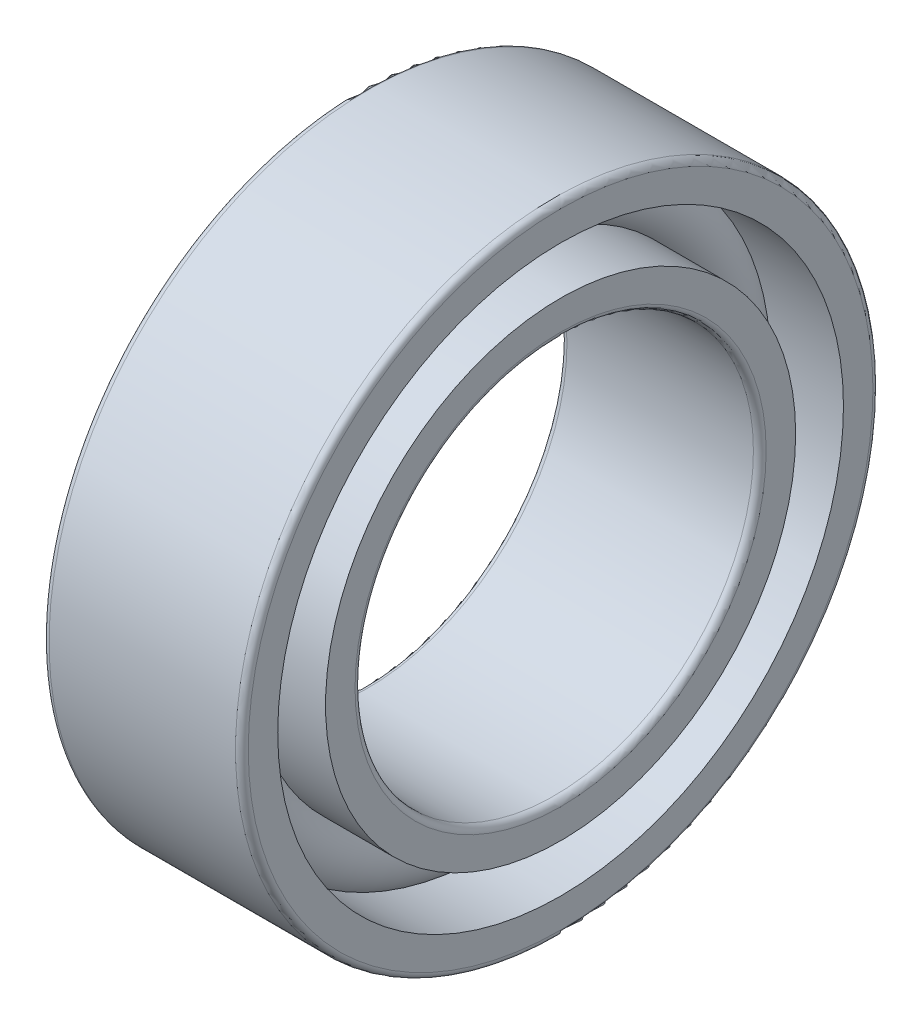
ISO-10303-21;
HEADER;
FILE_DESCRIPTION(('STEP AP214'),'2;1');
FILE_NAME('part.step','',(''),(''),'','','');
FILE_SCHEMA(('AUTOMOTIVE_DESIGN { 1 0 10303 214 1 1 1 1 }'));
ENDSEC;
DATA;
#1=APPLICATION_CONTEXT('core data for automotive mechanical design processes');
#2=APPLICATION_PROTOCOL_DEFINITION('international standard','automotive_design',2000,#1);
#3=PRODUCT_CONTEXT('',#1,'mechanical');
#4=PRODUCT('Part','Part','',(#3));
#5=PRODUCT_RELATED_PRODUCT_CATEGORY('part','',(#4));
#6=PRODUCT_DEFINITION_FORMATION('','',#4);
#7=PRODUCT_DEFINITION_CONTEXT('part definition',#1,'design');
#8=PRODUCT_DEFINITION('design','',#6,#7);
#9=PRODUCT_DEFINITION_SHAPE('','',#8);
#10=(LENGTH_UNIT() NAMED_UNIT(*) SI_UNIT(.MILLI.,.METRE.));
#11=(NAMED_UNIT(*) PLANE_ANGLE_UNIT() SI_UNIT($,.RADIAN.));
#12=(NAMED_UNIT(*) SI_UNIT($,.STERADIAN.) SOLID_ANGLE_UNIT());
#13=UNCERTAINTY_MEASURE_WITH_UNIT(LENGTH_MEASURE(1.E-05),#10,'distance_accuracy_value','');
#14=(GEOMETRIC_REPRESENTATION_CONTEXT(3) GLOBAL_UNCERTAINTY_ASSIGNED_CONTEXT((#13)) GLOBAL_UNIT_ASSIGNED_CONTEXT((#10,
#11,#12)) REPRESENTATION_CONTEXT('',''));
#15=CARTESIAN_POINT('',(0.,0.,0.));
#16=DIRECTION('',(0.,0.,1.));
#17=DIRECTION('',(1.,0.,0.));
#18=AXIS2_PLACEMENT_3D('',#15,#16,#17);
#19=CARTESIAN_POINT('',(0.,0.,0.));
#20=DIRECTION('',(-1.,0.,0.));
#21=DIRECTION('',(0.,0.,1.));
#22=AXIS2_PLACEMENT_3D('',#19,#20,#21);
#23=TOROIDAL_SURFACE('',#22,3.25,0.45);
#24=CARTESIAN_POINT('',(0.335410196624964,0.,0.));
#25=DIRECTION('',(-1.,0.,0.));
#26=DIRECTION('',(0.,0.,1.));
#27=AXIS2_PLACEMENT_3D('',#24,#25,#26);
#28=CIRCLE('',#27,3.55);
#29=CARTESIAN_POINT('',(0.335410196624964,0.,3.55));
#30=VERTEX_POINT('',#29);
#31=EDGE_CURVE('E35',#30,#30,#28,.F.);
#32=ORIENTED_EDGE('',*,*,#31,.T.);
#33=EDGE_LOOP('',(#32));
#34=FACE_BOUND('',#33,.T.);
#35=CARTESIAN_POINT('',(0.335410196624969,0.,0.));
#36=DIRECTION('',(-1.,0.,0.));
#37=DIRECTION('',(0.,0.,1.));
#38=AXIS2_PLACEMENT_3D('',#35,#36,#37);
#39=CIRCLE('',#38,2.95);
#40=CARTESIAN_POINT('',(0.335410196624969,0.,2.95));
#41=VERTEX_POINT('',#40);
#42=EDGE_CURVE('E10',#41,#41,#39,.T.);
#43=ORIENTED_EDGE('',*,*,#42,.T.);
#44=EDGE_LOOP('',(#43));
#45=FACE_BOUND('',#44,.T.);
#46=ADVANCED_FACE('F31',(#34,#45),#23,.T.);
#47=CARTESIAN_POINT('',(-20.6375,0.,0.));
#48=DIRECTION('',(1.,0.,0.));
#49=DIRECTION('',(0.,0.,-1.));
#50=AXIS2_PLACEMENT_3D('',#47,#48,#49);
#51=CYLINDRICAL_SURFACE('',#50,2.95);
#52=CARTESIAN_POINT('',(1.25,0.,0.));
#53=DIRECTION('',(1.,0.,0.));
#54=DIRECTION('',(0.,0.,-1.));
#55=AXIS2_PLACEMENT_3D('',#52,#53,#54);
#56=CIRCLE('',#55,2.95);
#57=CARTESIAN_POINT('',(1.25,0.,-2.95));
#58=VERTEX_POINT('',#57);
#59=EDGE_CURVE('E44',#58,#58,#56,.T.);
#60=ORIENTED_EDGE('',*,*,#59,.F.);
#61=EDGE_LOOP('',(#60));
#62=FACE_BOUND('',#61,.T.);
#63=ORIENTED_EDGE('',*,*,#42,.F.);
#64=EDGE_LOOP('',(#63));
#65=FACE_BOUND('',#64,.T.);
#66=ADVANCED_FACE('F83',(#62,#65),#51,.T.);
#67=CARTESIAN_POINT('',(-20.6375,0.,0.));
#68=DIRECTION('',(1.,0.,0.));
#69=DIRECTION('',(0.,0.,-1.));
#70=AXIS2_PLACEMENT_3D('',#67,#68,#69);
#71=CYLINDRICAL_SURFACE('',#70,2.95);
#72=CARTESIAN_POINT('',(-1.25,0.,0.));
#73=DIRECTION('',(1.,0.,0.));
#74=DIRECTION('',(0.,0.,-1.));
#75=AXIS2_PLACEMENT_3D('',#72,#73,#74);
#76=CIRCLE('',#75,2.95);
#77=CARTESIAN_POINT('',(-1.25,0.,-2.95));
#78=VERTEX_POINT('',#77);
#79=EDGE_CURVE('E53',#78,#78,#76,.T.);
#80=ORIENTED_EDGE('',*,*,#79,.T.);
#81=EDGE_LOOP('',(#80));
#82=FACE_BOUND('',#81,.T.);
#83=CARTESIAN_POINT('',(-0.335410196624969,0.,0.));
#84=DIRECTION('',(1.,0.,0.));
#85=DIRECTION('',(0.,0.,-1.));
#86=AXIS2_PLACEMENT_3D('',#83,#84,#85);
#87=CIRCLE('',#86,2.95);
#88=CARTESIAN_POINT('',(-0.335410196624969,0.,-2.95));
#89=VERTEX_POINT('',#88);
#90=EDGE_CURVE('E39',#89,#89,#87,.T.);
#91=ORIENTED_EDGE('',*,*,#90,.F.);
#92=EDGE_LOOP('',(#91));
#93=FACE_BOUND('',#92,.T.);
#94=ADVANCED_FACE('F86',(#82,#93),#71,.T.);
#95=CARTESIAN_POINT('',(1.25,2.58,0.));
#96=DIRECTION('',(1.,0.,0.));
#97=DIRECTION('',(0.,0.,-1.));
#98=AXIS2_PLACEMENT_3D('',#95,#96,#97);
#99=PLANE('',#98);
#100=ORIENTED_EDGE('',*,*,#59,.T.);
#101=EDGE_LOOP('',(#100));
#102=FACE_BOUND('',#101,.T.);
#103=CARTESIAN_POINT('',(1.25,0.,0.));
#104=DIRECTION('',(1.,0.,0.));
#105=DIRECTION('',(0.,0.,-1.));
#106=AXIS2_PLACEMENT_3D('',#103,#104,#105);
#107=CIRCLE('',#106,2.58);
#108=CARTESIAN_POINT('',(1.25,0.,-2.58));
#109=VERTEX_POINT('',#108);
#110=EDGE_CURVE('E75',#109,#109,#107,.T.);
#111=ORIENTED_EDGE('',*,*,#110,.F.);
#112=EDGE_LOOP('',(#111));
#113=FACE_BOUND('',#112,.T.);
#114=ADVANCED_FACE('F80',(#102,#113),#99,.T.);
#115=CARTESIAN_POINT('',(1.17,0.,0.));
#116=DIRECTION('',(1.,0.,0.));
#117=DIRECTION('',(0.,0.,-1.));
#118=AXIS2_PLACEMENT_3D('',#115,#116,#117);
#119=TOROIDAL_SURFACE('',#118,2.58,0.0799999999999996);
#120=ORIENTED_EDGE('',*,*,#110,.T.);
#121=EDGE_LOOP('',(#120));
#122=FACE_BOUND('',#121,.T.);
#123=CARTESIAN_POINT('',(1.17,0.,0.));
#124=DIRECTION('',(1.,0.,0.));
#125=DIRECTION('',(0.,0.,-1.));
#126=AXIS2_PLACEMENT_3D('',#123,#124,#125);
#127=CIRCLE('',#126,2.5);
#128=CARTESIAN_POINT('',(1.17,0.,-2.5));
#129=VERTEX_POINT('',#128);
#130=EDGE_CURVE('E72',#129,#129,#127,.T.);
#131=ORIENTED_EDGE('',*,*,#130,.F.);
#132=EDGE_LOOP('',(#131));
#133=FACE_BOUND('',#132,.T.);
#134=ADVANCED_FACE('F97',(#122,#133),#119,.T.);
#135=CARTESIAN_POINT('',(-20.6375,0.,0.));
#136=DIRECTION('',(1.,0.,0.));
#137=DIRECTION('',(0.,0.,-1.));
#138=AXIS2_PLACEMENT_3D('',#135,#136,#137);
#139=CYLINDRICAL_SURFACE('',#138,2.5);
#140=ORIENTED_EDGE('',*,*,#130,.T.);
#141=EDGE_LOOP('',(#140));
#142=FACE_BOUND('',#141,.T.);
#143=CARTESIAN_POINT('',(-1.17,0.,0.));
#144=DIRECTION('',(1.,0.,0.));
#145=DIRECTION('',(0.,0.,-1.));
#146=AXIS2_PLACEMENT_3D('',#143,#144,#145);
#147=CIRCLE('',#146,2.5);
#148=CARTESIAN_POINT('',(-1.17,0.,-2.5));
#149=VERTEX_POINT('',#148);
#150=EDGE_CURVE('E69',#149,#149,#147,.T.);
#151=ORIENTED_EDGE('',*,*,#150,.F.);
#152=EDGE_LOOP('',(#151));
#153=FACE_BOUND('',#152,.T.);
#154=ADVANCED_FACE('F100',(#142,#153),#139,.F.);
#155=CARTESIAN_POINT('',(-1.17,0.,0.));
#156=DIRECTION('',(1.,0.,0.));
#157=DIRECTION('',(0.,0.,-1.));
#158=AXIS2_PLACEMENT_3D('',#155,#156,#157);
#159=TOROIDAL_SURFACE('',#158,2.58,0.0799999999999996);
#160=ORIENTED_EDGE('',*,*,#150,.T.);
#161=EDGE_LOOP('',(#160));
#162=FACE_BOUND('',#161,.T.);
#163=CARTESIAN_POINT('',(-1.25,0.,0.));
#164=DIRECTION('',(1.,0.,0.));
#165=DIRECTION('',(0.,0.,-1.));
#166=AXIS2_PLACEMENT_3D('',#163,#164,#165);
#167=CIRCLE('',#166,2.58);
#168=CARTESIAN_POINT('',(-1.25,0.,-2.58));
#169=VERTEX_POINT('',#168);
#170=EDGE_CURVE('E66',#169,#169,#167,.T.);
#171=ORIENTED_EDGE('',*,*,#170,.F.);
#172=EDGE_LOOP('',(#171));
#173=FACE_BOUND('',#172,.T.);
#174=ADVANCED_FACE('F104',(#162,#173),#159,.T.);
#175=CARTESIAN_POINT('',(-1.25,2.95,0.));
#176=DIRECTION('',(-1.,0.,0.));
#177=DIRECTION('',(0.,0.,1.));
#178=AXIS2_PLACEMENT_3D('',#175,#176,#177);
#179=PLANE('',#178);
#180=ORIENTED_EDGE('',*,*,#170,.T.);
#181=EDGE_LOOP('',(#180));
#182=FACE_BOUND('',#181,.T.);
#183=ORIENTED_EDGE('',*,*,#79,.F.);
#184=EDGE_LOOP('',(#183));
#185=FACE_BOUND('',#184,.T.);
#186=ADVANCED_FACE('F108',(#182,#185),#179,.T.);
#187=CARTESIAN_POINT('',(-0.335410196624964,0.,0.));
#188=DIRECTION('',(1.,0.,0.));
#189=DIRECTION('',(0.,0.,-1.));
#190=AXIS2_PLACEMENT_3D('',#187,#188,#189);
#191=CIRCLE('',#190,3.55);
#192=CARTESIAN_POINT('',(-0.335410196624964,0.,-3.55));
#193=VERTEX_POINT('',#192);
#194=EDGE_CURVE('E47',#193,#193,#191,.F.);
#195=ORIENTED_EDGE('',*,*,#194,.T.);
#196=EDGE_LOOP('',(#195));
#197=FACE_BOUND('',#196,.T.);
#198=ORIENTED_EDGE('',*,*,#90,.T.);
#199=EDGE_LOOP('',(#198));
#200=FACE_BOUND('',#199,.T.);
#201=ADVANCED_FACE('F33',(#197,#200),#23,.T.);
#202=CARTESIAN_POINT('',(-20.6375,0.,0.));
#203=DIRECTION('',(1.,0.,0.));
#204=DIRECTION('',(0.,0.,-1.));
#205=AXIS2_PLACEMENT_3D('',#202,#203,#204);
#206=CYLINDRICAL_SURFACE('',#205,3.55);
#207=CARTESIAN_POINT('',(1.25,0.,0.));
#208=DIRECTION('',(1.,0.,0.));
#209=DIRECTION('',(0.,0.,-1.));
#210=AXIS2_PLACEMENT_3D('',#207,#208,#209);
#211=CIRCLE('',#210,3.55000000000001);
#212=CARTESIAN_POINT('',(1.25,0.,-3.55000000000001));
#213=VERTEX_POINT('',#212);
#214=EDGE_CURVE('E49',#213,#213,#211,.T.);
#215=ORIENTED_EDGE('',*,*,#214,.T.);
#216=EDGE_LOOP('',(#215));
#217=FACE_BOUND('',#216,.T.);
#218=ORIENTED_EDGE('',*,*,#31,.F.);
#219=EDGE_LOOP('',(#218));
#220=FACE_BOUND('',#219,.T.);
#221=ADVANCED_FACE('F113',(#217,#220),#206,.F.);
#222=CARTESIAN_POINT('',(-20.6375,0.,0.));
#223=DIRECTION('',(1.,0.,0.));
#224=DIRECTION('',(0.,0.,-1.));
#225=AXIS2_PLACEMENT_3D('',#222,#223,#224);
#226=CYLINDRICAL_SURFACE('',#225,3.55);
#227=CARTESIAN_POINT('',(-1.25,0.,0.));
#228=DIRECTION('',(1.,0.,0.));
#229=DIRECTION('',(0.,0.,-1.));
#230=AXIS2_PLACEMENT_3D('',#227,#228,#229);
#231=CIRCLE('',#230,3.55000000000001);
#232=CARTESIAN_POINT('',(-1.25,0.,-3.55000000000001));
#233=VERTEX_POINT('',#232);
#234=EDGE_CURVE('E144',#233,#233,#231,.T.);
#235=ORIENTED_EDGE('',*,*,#234,.F.);
#236=EDGE_LOOP('',(#235));
#237=FACE_BOUND('',#236,.T.);
#238=ORIENTED_EDGE('',*,*,#194,.F.);
#239=EDGE_LOOP('',(#238));
#240=FACE_BOUND('',#239,.T.);
#241=ADVANCED_FACE('F116',(#237,#240),#226,.F.);
#242=CARTESIAN_POINT('',(1.25,3.92000000000001,0.));
#243=DIRECTION('',(1.,0.,0.));
#244=DIRECTION('',(0.,0.,-1.));
#245=AXIS2_PLACEMENT_3D('',#242,#243,#244);
#246=PLANE('',#245);
#247=CARTESIAN_POINT('',(1.25,0.,0.));
#248=DIRECTION('',(1.,0.,0.));
#249=DIRECTION('',(0.,0.,-1.));
#250=AXIS2_PLACEMENT_3D('',#247,#248,#249);
#251=CIRCLE('',#250,3.92000000000001);
#252=CARTESIAN_POINT('',(1.25,0.,-3.92000000000001));
#253=VERTEX_POINT('',#252);
#254=EDGE_CURVE('E55',#253,#253,#251,.T.);
#255=ORIENTED_EDGE('',*,*,#254,.T.);
#256=EDGE_LOOP('',(#255));
#257=FACE_BOUND('',#256,.T.);
#258=ORIENTED_EDGE('',*,*,#214,.F.);
#259=EDGE_LOOP('',(#258));
#260=FACE_BOUND('',#259,.T.);
#261=ADVANCED_FACE('F117',(#257,#260),#246,.T.);
#262=CARTESIAN_POINT('',(1.17,0.,0.));
#263=DIRECTION('',(1.,0.,0.));
#264=DIRECTION('',(0.,0.,-1.));
#265=AXIS2_PLACEMENT_3D('',#262,#263,#264);
#266=TOROIDAL_SURFACE('',#265,3.92000000000001,0.08);
#267=CARTESIAN_POINT('',(1.17,0.,0.));
#268=DIRECTION('',(1.,0.,0.));
#269=DIRECTION('',(0.,0.,-1.));
#270=AXIS2_PLACEMENT_3D('',#267,#268,#269);
#271=CIRCLE('',#270,4.00000000000001);
#272=CARTESIAN_POINT('',(1.17,0.,-4.00000000000001));
#273=VERTEX_POINT('',#272);
#274=EDGE_CURVE('E60',#273,#273,#271,.T.);
#275=ORIENTED_EDGE('',*,*,#274,.T.);
#276=EDGE_LOOP('',(#275));
#277=FACE_BOUND('',#276,.T.);
#278=ORIENTED_EDGE('',*,*,#254,.F.);
#279=EDGE_LOOP('',(#278));
#280=FACE_BOUND('',#279,.T.);
#281=ADVANCED_FACE('F120',(#277,#280),#266,.T.);
#282=CARTESIAN_POINT('',(-20.6375,0.,0.));
#283=DIRECTION('',(1.,0.,0.));
#284=DIRECTION('',(0.,0.,-1.));
#285=AXIS2_PLACEMENT_3D('',#282,#283,#284);
#286=CYLINDRICAL_SURFACE('',#285,4.00000000000001);
#287=CARTESIAN_POINT('',(-1.17,0.,0.));
#288=DIRECTION('',(1.,0.,0.));
#289=DIRECTION('',(0.,0.,-1.));
#290=AXIS2_PLACEMENT_3D('',#287,#288,#289);
#291=CIRCLE('',#290,4.00000000000001);
#292=CARTESIAN_POINT('',(-1.17,0.,-4.00000000000001));
#293=VERTEX_POINT('',#292);
#294=EDGE_CURVE('E148',#293,#293,#291,.T.);
#295=ORIENTED_EDGE('',*,*,#294,.T.);
#296=EDGE_LOOP('',(#295));
#297=FACE_BOUND('',#296,.T.);
#298=ORIENTED_EDGE('',*,*,#274,.F.);
#299=EDGE_LOOP('',(#298));
#300=FACE_BOUND('',#299,.T.);
#301=ADVANCED_FACE('F124',(#297,#300),#286,.T.);
#302=CARTESIAN_POINT('',(-1.17,0.,0.));
#303=DIRECTION('',(1.,0.,0.));
#304=DIRECTION('',(0.,0.,-1.));
#305=AXIS2_PLACEMENT_3D('',#302,#303,#304);
#306=TOROIDAL_SURFACE('',#305,3.92000000000001,0.08);
#307=CARTESIAN_POINT('',(-1.25,0.,0.));
#308=DIRECTION('',(1.,0.,0.));
#309=DIRECTION('',(0.,0.,-1.));
#310=AXIS2_PLACEMENT_3D('',#307,#308,#309);
#311=CIRCLE('',#310,3.92000000000001);
#312=CARTESIAN_POINT('',(-1.25,0.,-3.92000000000001));
#313=VERTEX_POINT('',#312);
#314=EDGE_CURVE('E145',#313,#313,#311,.T.);
#315=ORIENTED_EDGE('',*,*,#314,.T.);
#316=EDGE_LOOP('',(#315));
#317=FACE_BOUND('',#316,.T.);
#318=ORIENTED_EDGE('',*,*,#294,.F.);
#319=EDGE_LOOP('',(#318));
#320=FACE_BOUND('',#319,.T.);
#321=ADVANCED_FACE('F128',(#317,#320),#306,.T.);
#322=CARTESIAN_POINT('',(-1.25,3.55000000000001,0.));
#323=DIRECTION('',(-1.,0.,0.));
#324=DIRECTION('',(0.,0.,1.));
#325=AXIS2_PLACEMENT_3D('',#322,#323,#324);
#326=PLANE('',#325);
#327=ORIENTED_EDGE('',*,*,#234,.T.);
#328=EDGE_LOOP('',(#327));
#329=FACE_BOUND('',#328,.T.);
#330=ORIENTED_EDGE('',*,*,#314,.F.);
#331=EDGE_LOOP('',(#330));
#332=FACE_BOUND('',#331,.T.);
#333=ADVANCED_FACE('F132',(#329,#332),#326,.T.);
#334=CLOSED_SHELL('',(#46,#66,#94,#114,#134,#154,#174,#186,#201,#221,#241,#261,#281,#301,#321,#333));
#335=MANIFOLD_SOLID_BREP('B2',#334);
#336=ADVANCED_BREP_SHAPE_REPRESENTATION('',(#18,#335),#14);
#337=SHAPE_DEFINITION_REPRESENTATION(#9,#336);
ENDSEC;
END-ISO-10303-21;
